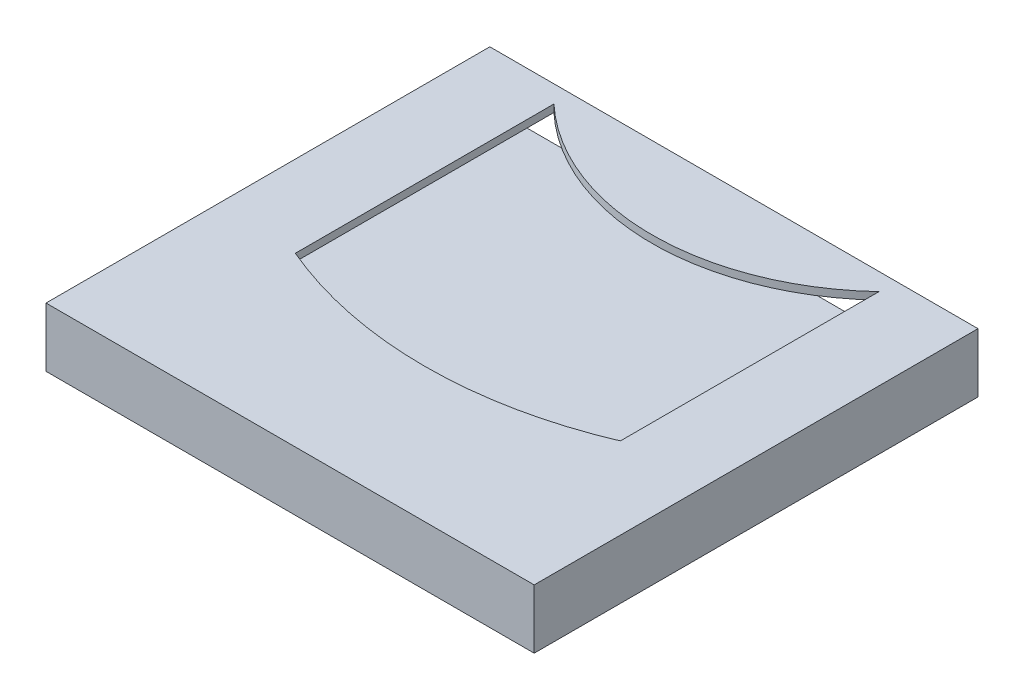
ISO-10303-21;
HEADER;
FILE_DESCRIPTION(('STEP AP214'),'2;1');
FILE_NAME('part.step','',(''),(''),'','','');
FILE_SCHEMA(('AUTOMOTIVE_DESIGN { 1 0 10303 214 1 1 1 1 }'));
ENDSEC;
DATA;
#1=APPLICATION_CONTEXT('core data for automotive mechanical design processes');
#2=APPLICATION_PROTOCOL_DEFINITION('international standard','automotive_design',2000,#1);
#3=PRODUCT_CONTEXT('',#1,'mechanical');
#4=PRODUCT('Part','Part','',(#3));
#5=PRODUCT_RELATED_PRODUCT_CATEGORY('part','',(#4));
#6=PRODUCT_DEFINITION_FORMATION('','',#4);
#7=PRODUCT_DEFINITION_CONTEXT('part definition',#1,'design');
#8=PRODUCT_DEFINITION('design','',#6,#7);
#9=PRODUCT_DEFINITION_SHAPE('','',#8);
#10=(LENGTH_UNIT() NAMED_UNIT(*) SI_UNIT(.MILLI.,.METRE.));
#11=(NAMED_UNIT(*) PLANE_ANGLE_UNIT() SI_UNIT($,.RADIAN.));
#12=(NAMED_UNIT(*) SI_UNIT($,.STERADIAN.) SOLID_ANGLE_UNIT());
#13=UNCERTAINTY_MEASURE_WITH_UNIT(LENGTH_MEASURE(1.E-05),#10,'distance_accuracy_value','');
#14=(GEOMETRIC_REPRESENTATION_CONTEXT(3) GLOBAL_UNCERTAINTY_ASSIGNED_CONTEXT((#13)) GLOBAL_UNIT_ASSIGNED_CONTEXT((#10,
#11,#12)) REPRESENTATION_CONTEXT('',''));
#15=CARTESIAN_POINT('',(0.,0.,0.));
#16=DIRECTION('',(0.,0.,1.));
#17=DIRECTION('',(1.,0.,0.));
#18=AXIS2_PLACEMENT_3D('',#15,#16,#17);
#19=CARTESIAN_POINT('',(-16.5,4.,-15.));
#20=DIRECTION('',(0.,0.,1.));
#21=DIRECTION('',(1.,0.,0.));
#22=AXIS2_PLACEMENT_3D('',#19,#20,#21);
#23=PLANE('',#22);
#24=DIRECTION('',(-1.,0.,0.));
#25=VECTOR('',#24,1.);
#26=CARTESIAN_POINT('',(-16.5,0.,-15.));
#27=LINE('',#26,#25);
#28=CARTESIAN_POINT('',(16.5,0.,-15.));
#29=VERTEX_POINT('',#28);
#30=CARTESIAN_POINT('',(-16.5,0.,-15.));
#31=VERTEX_POINT('',#30);
#32=EDGE_CURVE('E188',#29,#31,#27,.T.);
#33=ORIENTED_EDGE('',*,*,#32,.T.);
#34=DIRECTION('',(0.,-1.,0.));
#35=VECTOR('',#34,1.);
#36=CARTESIAN_POINT('',(-16.5,4.,-15.));
#37=LINE('',#36,#35);
#38=CARTESIAN_POINT('',(-16.5,4.,-15.));
#39=VERTEX_POINT('',#38);
#40=EDGE_CURVE('E199',#39,#31,#37,.T.);
#41=ORIENTED_EDGE('',*,*,#40,.F.);
#42=DIRECTION('',(-1.,0.,0.));
#43=VECTOR('',#42,1.);
#44=CARTESIAN_POINT('',(-16.5,4.,-15.));
#45=LINE('',#44,#43);
#46=CARTESIAN_POINT('',(16.5,4.,-15.));
#47=VERTEX_POINT('',#46);
#48=EDGE_CURVE('E197',#47,#39,#45,.T.);
#49=ORIENTED_EDGE('',*,*,#48,.F.);
#50=DIRECTION('',(0.,-1.,0.));
#51=VECTOR('',#50,1.);
#52=CARTESIAN_POINT('',(16.5,4.,-15.));
#53=LINE('',#52,#51);
#54=EDGE_CURVE('E202',#47,#29,#53,.T.);
#55=ORIENTED_EDGE('',*,*,#54,.T.);
#56=EDGE_LOOP('',(#33,#41,#49,#55));
#57=FACE_BOUND('',#56,.T.);
#58=DIRECTION('',(-1.,0.,0.));
#59=VECTOR('',#58,1.);
#60=CARTESIAN_POINT('',(-16.5,0.5,-15.));
#61=LINE('',#60,#59);
#62=CARTESIAN_POINT('',(16.,0.5,-15.));
#63=VERTEX_POINT('',#62);
#64=CARTESIAN_POINT('',(-16.,0.5,-15.));
#65=VERTEX_POINT('',#64);
#66=EDGE_CURVE('E162',#63,#65,#61,.T.);
#67=ORIENTED_EDGE('',*,*,#66,.F.);
#68=DIRECTION('',(0.,-1.,0.));
#69=VECTOR('',#68,1.);
#70=CARTESIAN_POINT('',(16.,4.,-15.));
#71=LINE('',#70,#69);
#72=CARTESIAN_POINT('',(16.,3.5,-15.));
#73=VERTEX_POINT('',#72);
#74=EDGE_CURVE('E167',#73,#63,#71,.T.);
#75=ORIENTED_EDGE('',*,*,#74,.F.);
#76=DIRECTION('',(-1.,0.,0.));
#77=VECTOR('',#76,1.);
#78=CARTESIAN_POINT('',(-16.5,3.5,-15.));
#79=LINE('',#78,#77);
#80=CARTESIAN_POINT('',(-16.,3.5,-15.));
#81=VERTEX_POINT('',#80);
#82=EDGE_CURVE('E173',#73,#81,#79,.T.);
#83=ORIENTED_EDGE('',*,*,#82,.T.);
#84=DIRECTION('',(0.,-1.,0.));
#85=VECTOR('',#84,1.);
#86=CARTESIAN_POINT('',(-16.,4.,-15.));
#87=LINE('',#86,#85);
#88=EDGE_CURVE('E174',#81,#65,#87,.T.);
#89=ORIENTED_EDGE('',*,*,#88,.T.);
#90=EDGE_LOOP('',(#67,#75,#83,#89));
#91=FACE_BOUND('',#90,.T.);
#92=ADVANCED_FACE('F32',(#57,#91),#23,.F.);
#93=CARTESIAN_POINT('',(-16.5,4.,-15.));
#94=DIRECTION('',(1.,0.,0.));
#95=DIRECTION('',(0.,0.,-1.));
#96=AXIS2_PLACEMENT_3D('',#93,#94,#95);
#97=PLANE('',#96);
#98=DIRECTION('',(0.,0.,1.));
#99=VECTOR('',#98,1.);
#100=CARTESIAN_POINT('',(-16.5,0.,-15.));
#101=LINE('',#100,#99);
#102=CARTESIAN_POINT('',(-16.5,0.,15.));
#103=VERTEX_POINT('',#102);
#104=EDGE_CURVE('E156',#31,#103,#101,.T.);
#105=ORIENTED_EDGE('',*,*,#104,.T.);
#106=DIRECTION('',(0.,-1.,0.));
#107=VECTOR('',#106,1.);
#108=CARTESIAN_POINT('',(-16.5,4.,15.));
#109=LINE('',#108,#107);
#110=CARTESIAN_POINT('',(-16.5,4.,15.));
#111=VERTEX_POINT('',#110);
#112=EDGE_CURVE('E208',#111,#103,#109,.T.);
#113=ORIENTED_EDGE('',*,*,#112,.F.);
#114=DIRECTION('',(0.,0.,1.));
#115=VECTOR('',#114,1.);
#116=CARTESIAN_POINT('',(-16.5,4.,-15.));
#117=LINE('',#116,#115);
#118=EDGE_CURVE('E190',#39,#111,#117,.T.);
#119=ORIENTED_EDGE('',*,*,#118,.F.);
#120=ORIENTED_EDGE('',*,*,#40,.T.);
#121=EDGE_LOOP('',(#105,#113,#119,#120));
#122=FACE_BOUND('',#121,.T.);
#123=ADVANCED_FACE('F34',(#122),#97,.F.);
#124=CARTESIAN_POINT('',(-16.5,4.,15.));
#125=DIRECTION('',(0.,0.,-1.));
#126=DIRECTION('',(-1.,0.,0.));
#127=AXIS2_PLACEMENT_3D('',#124,#125,#126);
#128=PLANE('',#127);
#129=DIRECTION('',(1.,0.,0.));
#130=VECTOR('',#129,1.);
#131=CARTESIAN_POINT('',(-16.5,0.,15.));
#132=LINE('',#131,#130);
#133=CARTESIAN_POINT('',(16.5,0.,15.));
#134=VERTEX_POINT('',#133);
#135=EDGE_CURVE('E184',#103,#134,#132,.T.);
#136=ORIENTED_EDGE('',*,*,#135,.T.);
#137=DIRECTION('',(0.,-1.,0.));
#138=VECTOR('',#137,1.);
#139=CARTESIAN_POINT('',(16.5,4.,15.));
#140=LINE('',#139,#138);
#141=CARTESIAN_POINT('',(16.5,4.,15.));
#142=VERTEX_POINT('',#141);
#143=EDGE_CURVE('E205',#142,#134,#140,.T.);
#144=ORIENTED_EDGE('',*,*,#143,.F.);
#145=DIRECTION('',(1.,0.,0.));
#146=VECTOR('',#145,1.);
#147=CARTESIAN_POINT('',(-16.5,4.,15.));
#148=LINE('',#147,#146);
#149=EDGE_CURVE('E193',#111,#142,#148,.T.);
#150=ORIENTED_EDGE('',*,*,#149,.F.);
#151=ORIENTED_EDGE('',*,*,#112,.T.);
#152=EDGE_LOOP('',(#136,#144,#150,#151));
#153=FACE_BOUND('',#152,.T.);
#154=ADVANCED_FACE('F239',(#153),#128,.F.);
#155=CARTESIAN_POINT('',(16.5,4.,-15.));
#156=DIRECTION('',(-1.,0.,0.));
#157=DIRECTION('',(0.,0.,1.));
#158=AXIS2_PLACEMENT_3D('',#155,#156,#157);
#159=PLANE('',#158);
#160=DIRECTION('',(0.,0.,-1.));
#161=VECTOR('',#160,1.);
#162=CARTESIAN_POINT('',(16.5,0.,-15.));
#163=LINE('',#162,#161);
#164=EDGE_CURVE('E186',#134,#29,#163,.T.);
#165=ORIENTED_EDGE('',*,*,#164,.T.);
#166=ORIENTED_EDGE('',*,*,#54,.F.);
#167=DIRECTION('',(0.,0.,-1.));
#168=VECTOR('',#167,1.);
#169=CARTESIAN_POINT('',(16.5,4.,-15.));
#170=LINE('',#169,#168);
#171=EDGE_CURVE('E195',#142,#47,#170,.T.);
#172=ORIENTED_EDGE('',*,*,#171,.F.);
#173=ORIENTED_EDGE('',*,*,#143,.T.);
#174=EDGE_LOOP('',(#165,#166,#172,#173));
#175=FACE_BOUND('',#174,.T.);
#176=ADVANCED_FACE('F245',(#175),#159,.F.);
#177=CARTESIAN_POINT('',(-16.5,4.,15.));
#178=DIRECTION('',(0.,1.,0.));
#179=DIRECTION('',(0.,0.,1.));
#180=AXIS2_PLACEMENT_3D('',#177,#178,#179);
#181=PLANE('',#180);
#182=CARTESIAN_POINT('',(0.,4.,-22.0856547287624));
#183=DIRECTION('',(0.,1.,0.));
#184=DIRECTION('',(0.,0.,1.));
#185=AXIS2_PLACEMENT_3D('',#182,#183,#184);
#186=CIRCLE('',#185,27.9896898900271);
#187=CARTESIAN_POINT('',(-10.9855661323137,4.,3.65808386710687));
#188=VERTEX_POINT('',#187);
#189=CARTESIAN_POINT('',(10.9855661323137,4.,3.65808386710687));
#190=VERTEX_POINT('',#189);
#191=EDGE_CURVE('E47',#188,#190,#186,.T.);
#192=ORIENTED_EDGE('',*,*,#191,.F.);
#193=DIRECTION('',(0.,0.,1.));
#194=VECTOR('',#193,1.);
#195=CARTESIAN_POINT('',(-10.9855661323137,4.,-13.8198936737085));
#196=LINE('',#195,#194);
#197=CARTESIAN_POINT('',(-10.9855661323137,4.,-13.8198936737085));
#198=VERTEX_POINT('',#197);
#199=EDGE_CURVE('E140',#198,#188,#196,.T.);
#200=ORIENTED_EDGE('',*,*,#199,.F.);
#201=CARTESIAN_POINT('',(0.,4.,-25.5256422221372));
#202=DIRECTION('',(0.,-1.,0.));
#203=DIRECTION('',(0.,0.,1.));
#204=AXIS2_PLACEMENT_3D('',#201,#202,#203);
#205=CIRCLE('',#204,16.0532617348151);
#206=CARTESIAN_POINT('',(10.9855661323137,4.,-13.8198936737085));
#207=VERTEX_POINT('',#206);
#208=EDGE_CURVE('E124',#207,#198,#205,.T.);
#209=ORIENTED_EDGE('',*,*,#208,.F.);
#210=DIRECTION('',(0.,0.,-1.));
#211=VECTOR('',#210,1.);
#212=CARTESIAN_POINT('',(10.9855661323137,4.,-13.8198936737085));
#213=LINE('',#212,#211);
#214=EDGE_CURVE('E133',#190,#207,#213,.T.);
#215=ORIENTED_EDGE('',*,*,#214,.F.);
#216=EDGE_LOOP('',(#192,#200,#209,#215));
#217=FACE_BOUND('',#216,.T.);
#218=ORIENTED_EDGE('',*,*,#118,.T.);
#219=ORIENTED_EDGE('',*,*,#149,.T.);
#220=ORIENTED_EDGE('',*,*,#171,.T.);
#221=ORIENTED_EDGE('',*,*,#48,.T.);
#222=EDGE_LOOP('',(#218,#219,#220,#221));
#223=FACE_BOUND('',#222,.T.);
#224=ADVANCED_FACE('F137',(#217,#223),#181,.T.);
#225=CARTESIAN_POINT('',(-16.5,0.,15.));
#226=DIRECTION('',(0.,1.,0.));
#227=DIRECTION('',(0.,0.,1.));
#228=AXIS2_PLACEMENT_3D('',#225,#226,#227);
#229=PLANE('',#228);
#230=ORIENTED_EDGE('',*,*,#104,.F.);
#231=ORIENTED_EDGE('',*,*,#32,.F.);
#232=ORIENTED_EDGE('',*,*,#164,.F.);
#233=ORIENTED_EDGE('',*,*,#135,.F.);
#234=EDGE_LOOP('',(#230,#231,#232,#233));
#235=FACE_BOUND('',#234,.T.);
#236=ADVANCED_FACE('F260',(#235),#229,.F.);
#237=CARTESIAN_POINT('',(-16.,4.,-15.));
#238=DIRECTION('',(1.,0.,0.));
#239=DIRECTION('',(0.,0.,-1.));
#240=AXIS2_PLACEMENT_3D('',#237,#238,#239);
#241=PLANE('',#240);
#242=DIRECTION('',(0.,0.,1.));
#243=VECTOR('',#242,1.);
#244=CARTESIAN_POINT('',(-16.,0.5,-15.));
#245=LINE('',#244,#243);
#246=CARTESIAN_POINT('',(-16.,0.5,14.5));
#247=VERTEX_POINT('',#246);
#248=EDGE_CURVE('E147',#65,#247,#245,.T.);
#249=ORIENTED_EDGE('',*,*,#248,.F.);
#250=ORIENTED_EDGE('',*,*,#88,.F.);
#251=DIRECTION('',(0.,0.,1.));
#252=VECTOR('',#251,1.);
#253=CARTESIAN_POINT('',(-16.,3.5,-15.));
#254=LINE('',#253,#252);
#255=CARTESIAN_POINT('',(-16.,3.5,14.5));
#256=VERTEX_POINT('',#255);
#257=EDGE_CURVE('E158',#81,#256,#254,.T.);
#258=ORIENTED_EDGE('',*,*,#257,.T.);
#259=DIRECTION('',(0.,-1.,0.));
#260=VECTOR('',#259,1.);
#261=CARTESIAN_POINT('',(-16.,4.,14.5));
#262=LINE('',#261,#260);
#263=EDGE_CURVE('E153',#256,#247,#262,.T.);
#264=ORIENTED_EDGE('',*,*,#263,.T.);
#265=EDGE_LOOP('',(#249,#250,#258,#264));
#266=FACE_BOUND('',#265,.T.);
#267=ADVANCED_FACE('F268',(#266),#241,.T.);
#268=CARTESIAN_POINT('',(-16.5,4.,14.5));
#269=DIRECTION('',(0.,0.,-1.));
#270=DIRECTION('',(-1.,0.,0.));
#271=AXIS2_PLACEMENT_3D('',#268,#269,#270);
#272=PLANE('',#271);
#273=DIRECTION('',(1.,0.,0.));
#274=VECTOR('',#273,1.);
#275=CARTESIAN_POINT('',(-16.5,0.5,14.5));
#276=LINE('',#275,#274);
#277=CARTESIAN_POINT('',(16.,0.5,14.5));
#278=VERTEX_POINT('',#277);
#279=EDGE_CURVE('E152',#247,#278,#276,.T.);
#280=ORIENTED_EDGE('',*,*,#279,.F.);
#281=ORIENTED_EDGE('',*,*,#263,.F.);
#282=DIRECTION('',(1.,0.,0.));
#283=VECTOR('',#282,1.);
#284=CARTESIAN_POINT('',(-16.5,3.5,14.5));
#285=LINE('',#284,#283);
#286=CARTESIAN_POINT('',(16.,3.5,14.5));
#287=VERTEX_POINT('',#286);
#288=EDGE_CURVE('E161',#256,#287,#285,.T.);
#289=ORIENTED_EDGE('',*,*,#288,.T.);
#290=DIRECTION('',(0.,-1.,0.));
#291=VECTOR('',#290,1.);
#292=CARTESIAN_POINT('',(16.,4.,14.5));
#293=LINE('',#292,#291);
#294=EDGE_CURVE('E157',#287,#278,#293,.T.);
#295=ORIENTED_EDGE('',*,*,#294,.T.);
#296=EDGE_LOOP('',(#280,#281,#289,#295));
#297=FACE_BOUND('',#296,.T.);
#298=ADVANCED_FACE('F272',(#297),#272,.T.);
#299=CARTESIAN_POINT('',(16.,4.,-15.));
#300=DIRECTION('',(-1.,0.,0.));
#301=DIRECTION('',(0.,0.,1.));
#302=AXIS2_PLACEMENT_3D('',#299,#300,#301);
#303=PLANE('',#302);
#304=DIRECTION('',(0.,0.,-1.));
#305=VECTOR('',#304,1.);
#306=CARTESIAN_POINT('',(16.,0.5,-15.));
#307=LINE('',#306,#305);
#308=EDGE_CURVE('E164',#278,#63,#307,.T.);
#309=ORIENTED_EDGE('',*,*,#308,.F.);
#310=ORIENTED_EDGE('',*,*,#294,.F.);
#311=DIRECTION('',(0.,0.,-1.));
#312=VECTOR('',#311,1.);
#313=CARTESIAN_POINT('',(16.,3.5,-15.));
#314=LINE('',#313,#312);
#315=EDGE_CURVE('E169',#287,#73,#314,.T.);
#316=ORIENTED_EDGE('',*,*,#315,.T.);
#317=ORIENTED_EDGE('',*,*,#74,.T.);
#318=EDGE_LOOP('',(#309,#310,#316,#317));
#319=FACE_BOUND('',#318,.T.);
#320=ADVANCED_FACE('F277',(#319),#303,.T.);
#321=CARTESIAN_POINT('',(-16.5,3.5,15.));
#322=DIRECTION('',(0.,1.,0.));
#323=DIRECTION('',(0.,0.,1.));
#324=AXIS2_PLACEMENT_3D('',#321,#322,#323);
#325=PLANE('',#324);
#326=DIRECTION('',(0.,0.,1.));
#327=VECTOR('',#326,1.);
#328=CARTESIAN_POINT('',(-10.9855661323137,3.5,15.));
#329=LINE('',#328,#327);
#330=CARTESIAN_POINT('',(-10.9855661323137,3.5,-13.8198936737085));
#331=VERTEX_POINT('',#330);
#332=CARTESIAN_POINT('',(-10.9855661323137,3.5,3.65808386710687));
#333=VERTEX_POINT('',#332);
#334=EDGE_CURVE('E40',#331,#333,#329,.T.);
#335=ORIENTED_EDGE('',*,*,#334,.T.);
#336=CARTESIAN_POINT('',(0.,3.5,-22.0856547287624));
#337=DIRECTION('',(0.,1.,0.));
#338=DIRECTION('',(0.,0.,1.));
#339=AXIS2_PLACEMENT_3D('',#336,#337,#338);
#340=CIRCLE('',#339,27.9896898900271);
#341=CARTESIAN_POINT('',(10.9855661323137,3.5,3.65808386710687));
#342=VERTEX_POINT('',#341);
#343=EDGE_CURVE('E11',#333,#342,#340,.T.);
#344=ORIENTED_EDGE('',*,*,#343,.T.);
#345=DIRECTION('',(0.,0.,-1.));
#346=VECTOR('',#345,1.);
#347=CARTESIAN_POINT('',(10.9855661323137,3.5,15.));
#348=LINE('',#347,#346);
#349=CARTESIAN_POINT('',(10.9855661323137,3.5,-13.8198936737085));
#350=VERTEX_POINT('',#349);
#351=EDGE_CURVE('E211',#342,#350,#348,.T.);
#352=ORIENTED_EDGE('',*,*,#351,.T.);
#353=CARTESIAN_POINT('',(0.,3.5,-25.5256422221372));
#354=DIRECTION('',(0.,1.,0.));
#355=DIRECTION('',(0.,0.,1.));
#356=AXIS2_PLACEMENT_3D('',#353,#354,#355);
#357=CIRCLE('',#356,16.0532617348151);
#358=EDGE_CURVE('E127',#350,#331,#357,.F.);
#359=ORIENTED_EDGE('',*,*,#358,.T.);
#360=EDGE_LOOP('',(#335,#344,#352,#359));
#361=FACE_BOUND('',#360,.T.);
#362=ORIENTED_EDGE('',*,*,#257,.F.);
#363=ORIENTED_EDGE('',*,*,#82,.F.);
#364=ORIENTED_EDGE('',*,*,#315,.F.);
#365=ORIENTED_EDGE('',*,*,#288,.F.);
#366=EDGE_LOOP('',(#362,#363,#364,#365));
#367=FACE_BOUND('',#366,.T.);
#368=ADVANCED_FACE('F215',(#361,#367),#325,.F.);
#369=CARTESIAN_POINT('',(-16.5,0.5,15.));
#370=DIRECTION('',(0.,1.,0.));
#371=DIRECTION('',(0.,0.,1.));
#372=AXIS2_PLACEMENT_3D('',#369,#370,#371);
#373=PLANE('',#372);
#374=ORIENTED_EDGE('',*,*,#248,.T.);
#375=ORIENTED_EDGE('',*,*,#279,.T.);
#376=ORIENTED_EDGE('',*,*,#308,.T.);
#377=ORIENTED_EDGE('',*,*,#66,.T.);
#378=EDGE_LOOP('',(#374,#375,#376,#377));
#379=FACE_BOUND('',#378,.T.);
#380=ADVANCED_FACE('F222',(#379),#373,.T.);
#381=CARTESIAN_POINT('',(0.,3.,-22.0856547287624));
#382=DIRECTION('',(0.,1.,0.));
#383=DIRECTION('',(0.,0.,1.));
#384=AXIS2_PLACEMENT_3D('',#381,#382,#383);
#385=CYLINDRICAL_SURFACE('',#384,27.9896898900271);
#386=DIRECTION('',(0.,1.,0.));
#387=VECTOR('',#386,1.);
#388=CARTESIAN_POINT('',(-10.9855661323137,3.,3.65808386710687));
#389=LINE('',#388,#387);
#390=EDGE_CURVE('E145',#333,#188,#389,.T.);
#391=ORIENTED_EDGE('',*,*,#390,.T.);
#392=ORIENTED_EDGE('',*,*,#191,.T.);
#393=DIRECTION('',(0.,1.,0.));
#394=VECTOR('',#393,1.);
#395=CARTESIAN_POINT('',(10.9855661323137,3.,3.65808386710687));
#396=LINE('',#395,#394);
#397=EDGE_CURVE('E130',#342,#190,#396,.T.);
#398=ORIENTED_EDGE('',*,*,#397,.F.);
#399=ORIENTED_EDGE('',*,*,#343,.F.);
#400=EDGE_LOOP('',(#391,#392,#398,#399));
#401=FACE_BOUND('',#400,.T.);
#402=ADVANCED_FACE('F220',(#401),#385,.F.);
#403=CARTESIAN_POINT('',(-10.9855661323137,3.,-13.8198936737085));
#404=DIRECTION('',(-1.,0.,0.));
#405=DIRECTION('',(0.,0.,1.));
#406=AXIS2_PLACEMENT_3D('',#403,#404,#405);
#407=PLANE('',#406);
#408=DIRECTION('',(0.,1.,0.));
#409=VECTOR('',#408,1.);
#410=CARTESIAN_POINT('',(-10.9855661323137,3.,-13.8198936737085));
#411=LINE('',#410,#409);
#412=EDGE_CURVE('E129',#331,#198,#411,.T.);
#413=ORIENTED_EDGE('',*,*,#412,.T.);
#414=ORIENTED_EDGE('',*,*,#199,.T.);
#415=ORIENTED_EDGE('',*,*,#390,.F.);
#416=ORIENTED_EDGE('',*,*,#334,.F.);
#417=EDGE_LOOP('',(#413,#414,#415,#416));
#418=FACE_BOUND('',#417,.T.);
#419=ADVANCED_FACE('F219',(#418),#407,.F.);
#420=CARTESIAN_POINT('',(0.,3.,-25.5256422221372));
#421=DIRECTION('',(0.,1.,0.));
#422=DIRECTION('',(0.,0.,1.));
#423=AXIS2_PLACEMENT_3D('',#420,#421,#422);
#424=CYLINDRICAL_SURFACE('',#423,16.0532617348151);
#425=DIRECTION('',(0.,1.,0.));
#426=VECTOR('',#425,1.);
#427=CARTESIAN_POINT('',(10.9855661323137,3.,-13.8198936737085));
#428=LINE('',#427,#426);
#429=EDGE_CURVE('E55',#350,#207,#428,.T.);
#430=ORIENTED_EDGE('',*,*,#429,.T.);
#431=ORIENTED_EDGE('',*,*,#208,.T.);
#432=ORIENTED_EDGE('',*,*,#412,.F.);
#433=ORIENTED_EDGE('',*,*,#358,.F.);
#434=EDGE_LOOP('',(#430,#431,#432,#433));
#435=FACE_BOUND('',#434,.T.);
#436=ADVANCED_FACE('F121',(#435),#424,.T.);
#437=CARTESIAN_POINT('',(10.9855661323137,3.,-13.8198936737085));
#438=DIRECTION('',(1.,0.,0.));
#439=DIRECTION('',(0.,0.,-1.));
#440=AXIS2_PLACEMENT_3D('',#437,#438,#439);
#441=PLANE('',#440);
#442=ORIENTED_EDGE('',*,*,#397,.T.);
#443=ORIENTED_EDGE('',*,*,#214,.T.);
#444=ORIENTED_EDGE('',*,*,#429,.F.);
#445=ORIENTED_EDGE('',*,*,#351,.F.);
#446=EDGE_LOOP('',(#442,#443,#444,#445));
#447=FACE_BOUND('',#446,.T.);
#448=ADVANCED_FACE('F134',(#447),#441,.F.);
#449=CLOSED_SHELL('',(#92,#123,#154,#176,#224,#236,#267,#298,#320,#368,#380,#402,#419,#436,#448));
#450=MANIFOLD_SOLID_BREP('B2',#449);
#451=ADVANCED_BREP_SHAPE_REPRESENTATION('',(#18,#450),#14);
#452=SHAPE_DEFINITION_REPRESENTATION(#9,#451);
ENDSEC;
END-ISO-10303-21;
